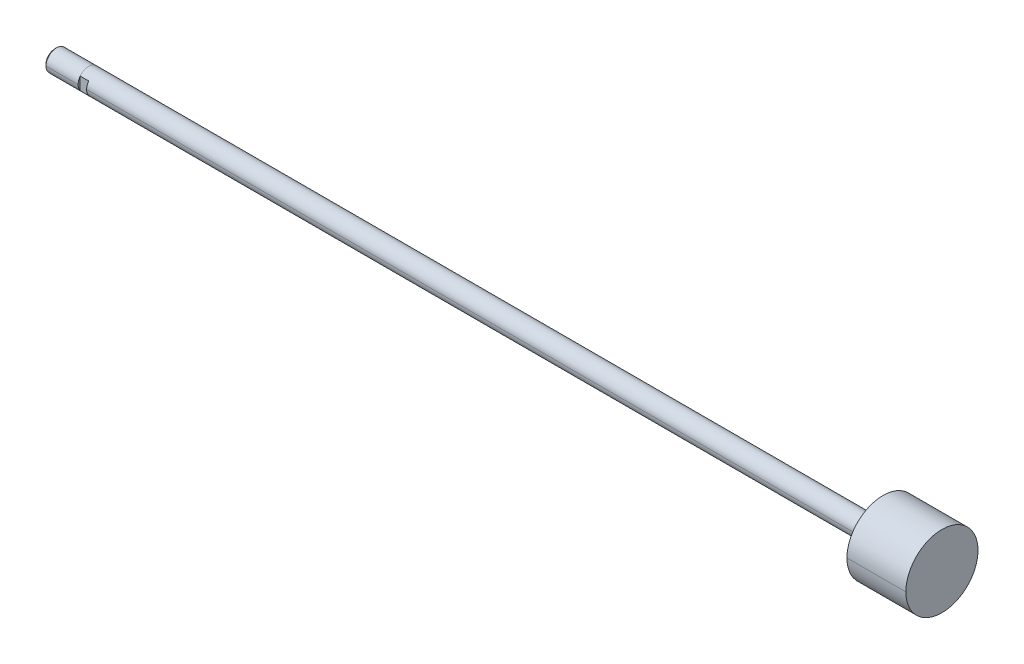
ISO-10303-21;
HEADER;
FILE_DESCRIPTION(('STEP AP214'),'2;1');
FILE_NAME('part.step','',(''),(''),'','','');
FILE_SCHEMA(('AUTOMOTIVE_DESIGN { 1 0 10303 214 1 1 1 1 }'));
ENDSEC;
DATA;
#1=APPLICATION_CONTEXT('core data for automotive mechanical design processes');
#2=APPLICATION_PROTOCOL_DEFINITION('international standard','automotive_design',2000,#1);
#3=PRODUCT_CONTEXT('',#1,'mechanical');
#4=PRODUCT('Part','Part','',(#3));
#5=PRODUCT_RELATED_PRODUCT_CATEGORY('part','',(#4));
#6=PRODUCT_DEFINITION_FORMATION('','',#4);
#7=PRODUCT_DEFINITION_CONTEXT('part definition',#1,'design');
#8=PRODUCT_DEFINITION('design','',#6,#7);
#9=PRODUCT_DEFINITION_SHAPE('','',#8);
#10=(LENGTH_UNIT() NAMED_UNIT(*) SI_UNIT(.MILLI.,.METRE.));
#11=(NAMED_UNIT(*) PLANE_ANGLE_UNIT() SI_UNIT($,.RADIAN.));
#12=(NAMED_UNIT(*) SI_UNIT($,.STERADIAN.) SOLID_ANGLE_UNIT());
#13=UNCERTAINTY_MEASURE_WITH_UNIT(LENGTH_MEASURE(1.E-05),#10,'distance_accuracy_value','');
#14=(GEOMETRIC_REPRESENTATION_CONTEXT(3) GLOBAL_UNCERTAINTY_ASSIGNED_CONTEXT((#13)) GLOBAL_UNIT_ASSIGNED_CONTEXT((#10,
#11,#12)) REPRESENTATION_CONTEXT('',''));
#15=CARTESIAN_POINT('',(0.,0.,0.));
#16=DIRECTION('',(0.,0.,1.));
#17=DIRECTION('',(1.,0.,0.));
#18=AXIS2_PLACEMENT_3D('',#15,#16,#17);
#19=CARTESIAN_POINT('',(317.3984,0.,0.));
#20=DIRECTION('',(-1.,0.,0.));
#21=DIRECTION('',(0.,-1.,0.));
#22=AXIS2_PLACEMENT_3D('',#19,#20,#21);
#23=CYLINDRICAL_SURFACE('',#22,3.9624);
#24=CARTESIAN_POINT('',(295.275,0.,0.));
#25=DIRECTION('',(1.,0.,0.));
#26=DIRECTION('',(0.,0.,-1.));
#27=AXIS2_PLACEMENT_3D('',#24,#25,#26);
#28=CIRCLE('',#27,3.9624);
#29=CARTESIAN_POINT('',(295.275,0.,-3.9624));
#30=VERTEX_POINT('',#29);
#31=CARTESIAN_POINT('',(295.275,0.,3.9624));
#32=VERTEX_POINT('',#31);
#33=EDGE_CURVE('E10',#30,#32,#28,.T.);
#34=ORIENTED_EDGE('',*,*,#33,.F.);
#35=DIRECTION('',(-1.,0.,0.));
#36=VECTOR('',#35,1.);
#37=CARTESIAN_POINT('',(295.275,0.,-3.9624));
#38=LINE('',#37,#36);
#39=CARTESIAN_POINT('',(0.,0.,-3.9624));
#40=VERTEX_POINT('',#39);
#41=EDGE_CURVE('E24',#30,#40,#38,.T.);
#42=ORIENTED_EDGE('',*,*,#41,.T.);
#43=CARTESIAN_POINT('',(0.,0.,0.));
#44=DIRECTION('',(1.,0.,0.));
#45=DIRECTION('',(0.,0.,-1.));
#46=AXIS2_PLACEMENT_3D('',#43,#44,#45);
#47=CIRCLE('',#46,3.9624);
#48=CARTESIAN_POINT('',(0.,2.37065154757084,-3.175));
#49=VERTEX_POINT('',#48);
#50=EDGE_CURVE('E244',#40,#49,#47,.T.);
#51=ORIENTED_EDGE('',*,*,#50,.T.);
#52=DIRECTION('',(1.,0.,0.));
#53=VECTOR('',#52,1.);
#54=CARTESIAN_POINT('',(317.3984,2.37065154757084,-3.175));
#55=LINE('',#54,#53);
#56=CARTESIAN_POINT('',(-3.175,2.37065154757084,-3.175));
#57=VERTEX_POINT('',#56);
#58=EDGE_CURVE('E239',#57,#49,#55,.T.);
#59=ORIENTED_EDGE('',*,*,#58,.F.);
#60=CARTESIAN_POINT('',(-3.17499999999997,0.,0.));
#61=DIRECTION('',(1.,0.,0.));
#62=DIRECTION('',(0.,0.,-1.));
#63=AXIS2_PLACEMENT_3D('',#60,#61,#62);
#64=CIRCLE('',#63,3.9624);
#65=CARTESIAN_POINT('',(-3.17499999999997,2.37065154757084,3.175));
#66=VERTEX_POINT('',#65);
#67=EDGE_CURVE('E235',#57,#66,#64,.T.);
#68=ORIENTED_EDGE('',*,*,#67,.T.);
#69=DIRECTION('',(1.,0.,0.));
#70=VECTOR('',#69,1.);
#71=CARTESIAN_POINT('',(317.3984,2.37065154757084,3.175));
#72=LINE('',#71,#70);
#73=CARTESIAN_POINT('',(0.,2.37065154757084,3.175));
#74=VERTEX_POINT('',#73);
#75=EDGE_CURVE('E231',#66,#74,#72,.T.);
#76=ORIENTED_EDGE('',*,*,#75,.T.);
#77=CARTESIAN_POINT('',(0.,0.,0.));
#78=DIRECTION('',(1.,0.,0.));
#79=DIRECTION('',(0.,0.,-1.));
#80=AXIS2_PLACEMENT_3D('',#77,#78,#79);
#81=CIRCLE('',#80,3.9624);
#82=CARTESIAN_POINT('',(0.,0.,3.9624));
#83=VERTEX_POINT('',#82);
#84=EDGE_CURVE('E227',#74,#83,#81,.T.);
#85=ORIENTED_EDGE('',*,*,#84,.T.);
#86=DIRECTION('',(-1.,0.,0.));
#87=VECTOR('',#86,1.);
#88=CARTESIAN_POINT('',(295.275,0.,3.9624));
#89=LINE('',#88,#87);
#90=EDGE_CURVE('E222',#32,#83,#89,.T.);
#91=ORIENTED_EDGE('',*,*,#90,.F.);
#92=EDGE_LOOP('',(#34,#42,#51,#59,#68,#76,#85,#91));
#93=FACE_BOUND('',#92,.T.);
#94=ADVANCED_FACE('F16',(#93),#23,.T.);
#95=CARTESIAN_POINT('',(317.3984,0.,0.));
#96=DIRECTION('',(-1.,0.,0.));
#97=DIRECTION('',(0.,1.,0.));
#98=AXIS2_PLACEMENT_3D('',#95,#96,#97);
#99=CYLINDRICAL_SURFACE('',#98,3.9624);
#100=CARTESIAN_POINT('',(0.,0.,0.));
#101=DIRECTION('',(1.,0.,0.));
#102=DIRECTION('',(0.,0.,-1.));
#103=AXIS2_PLACEMENT_3D('',#100,#101,#102);
#104=CIRCLE('',#103,3.9624);
#105=CARTESIAN_POINT('',(0.,-2.37065154757084,3.175));
#106=VERTEX_POINT('',#105);
#107=EDGE_CURVE('E218',#83,#106,#104,.T.);
#108=ORIENTED_EDGE('',*,*,#107,.T.);
#109=DIRECTION('',(1.,0.,0.));
#110=VECTOR('',#109,1.);
#111=CARTESIAN_POINT('',(317.3984,-2.37065154757084,3.175));
#112=LINE('',#111,#110);
#113=CARTESIAN_POINT('',(-3.175,-2.37065154757084,3.175));
#114=VERTEX_POINT('',#113);
#115=EDGE_CURVE('E213',#114,#106,#112,.T.);
#116=ORIENTED_EDGE('',*,*,#115,.F.);
#117=CARTESIAN_POINT('',(-3.17499999999997,0.,0.));
#118=DIRECTION('',(1.,0.,0.));
#119=DIRECTION('',(0.,0.,-1.));
#120=AXIS2_PLACEMENT_3D('',#117,#118,#119);
#121=CIRCLE('',#120,3.9624);
#122=CARTESIAN_POINT('',(-3.17499999999997,-2.37065154757084,-3.175));
#123=VERTEX_POINT('',#122);
#124=EDGE_CURVE('E209',#114,#123,#121,.T.);
#125=ORIENTED_EDGE('',*,*,#124,.T.);
#126=DIRECTION('',(1.,0.,0.));
#127=VECTOR('',#126,1.);
#128=CARTESIAN_POINT('',(317.3984,-2.37065154757084,-3.175));
#129=LINE('',#128,#127);
#130=CARTESIAN_POINT('',(0.,-2.37065154757084,-3.175));
#131=VERTEX_POINT('',#130);
#132=EDGE_CURVE('E205',#123,#131,#129,.T.);
#133=ORIENTED_EDGE('',*,*,#132,.T.);
#134=CARTESIAN_POINT('',(0.,0.,0.));
#135=DIRECTION('',(1.,0.,0.));
#136=DIRECTION('',(0.,0.,-1.));
#137=AXIS2_PLACEMENT_3D('',#134,#135,#136);
#138=CIRCLE('',#137,3.9624);
#139=EDGE_CURVE('E201',#131,#40,#138,.T.);
#140=ORIENTED_EDGE('',*,*,#139,.T.);
#141=ORIENTED_EDGE('',*,*,#41,.F.);
#142=CARTESIAN_POINT('',(295.275,0.,0.));
#143=DIRECTION('',(1.,0.,0.));
#144=DIRECTION('',(0.,0.,-1.));
#145=AXIS2_PLACEMENT_3D('',#142,#143,#144);
#146=CIRCLE('',#145,3.9624);
#147=EDGE_CURVE('E196',#32,#30,#146,.T.);
#148=ORIENTED_EDGE('',*,*,#147,.F.);
#149=ORIENTED_EDGE('',*,*,#90,.T.);
#150=EDGE_LOOP('',(#108,#116,#125,#133,#140,#141,#148,#149));
#151=FACE_BOUND('',#150,.T.);
#152=ADVANCED_FACE('F276',(#151),#99,.T.);
#153=CARTESIAN_POINT('',(295.275,3.9624,0.));
#154=DIRECTION('',(1.,0.,0.));
#155=DIRECTION('',(0.,0.,-1.));
#156=AXIS2_PLACEMENT_3D('',#153,#154,#155);
#157=PLANE('',#156);
#158=CARTESIAN_POINT('',(295.275,0.,0.));
#159=DIRECTION('',(1.,0.,0.));
#160=DIRECTION('',(0.,0.,-1.));
#161=AXIS2_PLACEMENT_3D('',#158,#159,#160);
#162=CIRCLE('',#161,13.55725);
#163=CARTESIAN_POINT('',(295.275,0.,-13.55725));
#164=VERTEX_POINT('',#163);
#165=CARTESIAN_POINT('',(295.275,0.,13.55725));
#166=VERTEX_POINT('',#165);
#167=EDGE_CURVE('E191',#164,#166,#162,.T.);
#168=ORIENTED_EDGE('',*,*,#167,.F.);
#169=CARTESIAN_POINT('',(295.275,0.,0.));
#170=DIRECTION('',(1.,0.,0.));
#171=DIRECTION('',(0.,0.,-1.));
#172=AXIS2_PLACEMENT_3D('',#169,#170,#171);
#173=CIRCLE('',#172,13.55725);
#174=EDGE_CURVE('E186',#166,#164,#173,.T.);
#175=ORIENTED_EDGE('',*,*,#174,.F.);
#176=EDGE_LOOP('',(#168,#175));
#177=FACE_BOUND('',#176,.T.);
#178=ORIENTED_EDGE('',*,*,#33,.T.);
#179=ORIENTED_EDGE('',*,*,#147,.T.);
#180=EDGE_LOOP('',(#178,#179));
#181=FACE_BOUND('',#180,.T.);
#182=ADVANCED_FACE('F279',(#177,#181),#157,.F.);
#183=CARTESIAN_POINT('',(317.3984,0.,0.));
#184=DIRECTION('',(-1.,0.,0.));
#185=DIRECTION('',(0.,1.,0.));
#186=AXIS2_PLACEMENT_3D('',#183,#184,#185);
#187=CYLINDRICAL_SURFACE('',#186,13.55725);
#188=ORIENTED_EDGE('',*,*,#174,.T.);
#189=DIRECTION('',(-1.,0.,0.));
#190=VECTOR('',#189,1.);
#191=CARTESIAN_POINT('',(317.3984,0.,-13.55725));
#192=LINE('',#191,#190);
#193=CARTESIAN_POINT('',(317.3984,0.,-13.55725));
#194=VERTEX_POINT('',#193);
#195=EDGE_CURVE('E181',#194,#164,#192,.T.);
#196=ORIENTED_EDGE('',*,*,#195,.F.);
#197=CARTESIAN_POINT('',(317.3984,0.,0.));
#198=DIRECTION('',(1.,0.,0.));
#199=DIRECTION('',(0.,0.,-1.));
#200=AXIS2_PLACEMENT_3D('',#197,#198,#199);
#201=CIRCLE('',#200,13.55725);
#202=CARTESIAN_POINT('',(317.3984,0.,13.55725));
#203=VERTEX_POINT('',#202);
#204=EDGE_CURVE('E176',#203,#194,#201,.T.);
#205=ORIENTED_EDGE('',*,*,#204,.F.);
#206=DIRECTION('',(-1.,0.,0.));
#207=VECTOR('',#206,1.);
#208=CARTESIAN_POINT('',(317.3984,0.,13.55725));
#209=LINE('',#208,#207);
#210=EDGE_CURVE('E171',#203,#166,#209,.T.);
#211=ORIENTED_EDGE('',*,*,#210,.T.);
#212=EDGE_LOOP('',(#188,#196,#205,#211));
#213=FACE_BOUND('',#212,.T.);
#214=ADVANCED_FACE('F281',(#213),#187,.T.);
#215=CARTESIAN_POINT('',(317.3984,0.,0.));
#216=DIRECTION('',(-1.,0.,0.));
#217=DIRECTION('',(0.,-1.,0.));
#218=AXIS2_PLACEMENT_3D('',#215,#216,#217);
#219=CYLINDRICAL_SURFACE('',#218,13.55725);
#220=CARTESIAN_POINT('',(317.3984,0.,0.));
#221=DIRECTION('',(1.,0.,0.));
#222=DIRECTION('',(0.,0.,-1.));
#223=AXIS2_PLACEMENT_3D('',#220,#221,#222);
#224=CIRCLE('',#223,13.55725);
#225=EDGE_CURVE('E166',#194,#203,#224,.T.);
#226=ORIENTED_EDGE('',*,*,#225,.F.);
#227=ORIENTED_EDGE('',*,*,#195,.T.);
#228=ORIENTED_EDGE('',*,*,#167,.T.);
#229=ORIENTED_EDGE('',*,*,#210,.F.);
#230=EDGE_LOOP('',(#226,#227,#228,#229));
#231=FACE_BOUND('',#230,.T.);
#232=ADVANCED_FACE('F289',(#231),#219,.T.);
#233=CARTESIAN_POINT('',(317.3984,13.55725,0.));
#234=DIRECTION('',(-1.,0.,0.));
#235=DIRECTION('',(0.,0.,1.));
#236=AXIS2_PLACEMENT_3D('',#233,#234,#235);
#237=PLANE('',#236);
#238=ORIENTED_EDGE('',*,*,#225,.T.);
#239=ORIENTED_EDGE('',*,*,#204,.T.);
#240=EDGE_LOOP('',(#238,#239));
#241=FACE_BOUND('',#240,.T.);
#242=ADVANCED_FACE('F322',(#241),#237,.F.);
#243=CARTESIAN_POINT('',(0.,0.,0.));
#244=DIRECTION('',(1.,0.,0.));
#245=DIRECTION('',(0.,0.,-1.));
#246=AXIS2_PLACEMENT_3D('',#243,#244,#245);
#247=PLANE('',#246);
#248=DIRECTION('',(0.,1.,0.));
#249=VECTOR('',#248,1.);
#250=CARTESIAN_POINT('',(0.,-3.9624,-3.175));
#251=LINE('',#250,#249);
#252=EDGE_CURVE('E161',#131,#49,#251,.T.);
#253=ORIENTED_EDGE('',*,*,#252,.T.);
#254=ORIENTED_EDGE('',*,*,#50,.F.);
#255=ORIENTED_EDGE('',*,*,#139,.F.);
#256=EDGE_LOOP('',(#253,#254,#255));
#257=FACE_BOUND('',#256,.T.);
#258=ADVANCED_FACE('F256',(#257),#247,.F.);
#259=CARTESIAN_POINT('',(0.,-3.9624,-3.175));
#260=DIRECTION('',(0.,0.,1.));
#261=DIRECTION('',(1.,0.,0.));
#262=AXIS2_PLACEMENT_3D('',#259,#260,#261);
#263=PLANE('',#262);
#264=DIRECTION('',(0.,1.,0.));
#265=VECTOR('',#264,1.);
#266=CARTESIAN_POINT('',(-3.175,-3.9624,-3.175));
#267=LINE('',#266,#265);
#268=EDGE_CURVE('E156',#123,#57,#267,.T.);
#269=ORIENTED_EDGE('',*,*,#268,.T.);
#270=ORIENTED_EDGE('',*,*,#58,.T.);
#271=ORIENTED_EDGE('',*,*,#252,.F.);
#272=ORIENTED_EDGE('',*,*,#132,.F.);
#273=EDGE_LOOP('',(#269,#270,#271,#272));
#274=FACE_BOUND('',#273,.T.);
#275=ADVANCED_FACE('F259',(#274),#263,.F.);
#276=CARTESIAN_POINT('',(-3.175,3.96875,0.));
#277=DIRECTION('',(-1.,0.,0.));
#278=DIRECTION('',(0.,0.,1.));
#279=AXIS2_PLACEMENT_3D('',#276,#277,#278);
#280=PLANE('',#279);
#281=ORIENTED_EDGE('',*,*,#67,.F.);
#282=ORIENTED_EDGE('',*,*,#268,.F.);
#283=ORIENTED_EDGE('',*,*,#124,.F.);
#284=DIRECTION('',(0.,-1.,0.));
#285=VECTOR('',#284,1.);
#286=CARTESIAN_POINT('',(-3.175,3.9624,3.175));
#287=LINE('',#286,#285);
#288=EDGE_CURVE('E151',#66,#114,#287,.T.);
#289=ORIENTED_EDGE('',*,*,#288,.F.);
#290=EDGE_LOOP('',(#281,#282,#283,#289));
#291=FACE_BOUND('',#290,.T.);
#292=CARTESIAN_POINT('',(-3.175,0.,0.));
#293=DIRECTION('',(1.,0.,0.));
#294=DIRECTION('',(0.,0.,-1.));
#295=AXIS2_PLACEMENT_3D('',#292,#293,#294);
#296=CIRCLE('',#295,3.96875);
#297=CARTESIAN_POINT('',(-3.175,0.,-3.96875));
#298=VERTEX_POINT('',#297);
#299=CARTESIAN_POINT('',(-3.175,0.,3.96875));
#300=VERTEX_POINT('',#299);
#301=EDGE_CURVE('E147',#298,#300,#296,.T.);
#302=ORIENTED_EDGE('',*,*,#301,.T.);
#303=CARTESIAN_POINT('',(-3.175,0.,0.));
#304=DIRECTION('',(1.,0.,0.));
#305=DIRECTION('',(0.,0.,-1.));
#306=AXIS2_PLACEMENT_3D('',#303,#304,#305);
#307=CIRCLE('',#306,3.96875);
#308=EDGE_CURVE('E143',#300,#298,#307,.T.);
#309=ORIENTED_EDGE('',*,*,#308,.T.);
#310=EDGE_LOOP('',(#302,#309));
#311=FACE_BOUND('',#310,.T.);
#312=ADVANCED_FACE('F265',(#291,#311),#280,.F.);
#313=CARTESIAN_POINT('',(-3.175,0.,0.));
#314=DIRECTION('',(-1.,0.,0.));
#315=DIRECTION('',(0.,1.,0.));
#316=AXIS2_PLACEMENT_3D('',#313,#314,#315);
#317=CYLINDRICAL_SURFACE('',#316,3.96875);
#318=CARTESIAN_POINT('',(-15.24508,0.,0.));
#319=DIRECTION('',(1.,0.,0.));
#320=DIRECTION('',(0.,0.,-1.));
#321=AXIS2_PLACEMENT_3D('',#318,#319,#320);
#322=CIRCLE('',#321,3.96875);
#323=CARTESIAN_POINT('',(-15.2450800000016,0.,3.96875000000161));
#324=VERTEX_POINT('',#323);
#325=CARTESIAN_POINT('',(-15.24508,0.,-3.96875));
#326=VERTEX_POINT('',#325);
#327=EDGE_CURVE('E109',#324,#326,#322,.T.);
#328=ORIENTED_EDGE('',*,*,#327,.T.);
#329=DIRECTION('',(-1.,0.,0.));
#330=VECTOR('',#329,1.);
#331=CARTESIAN_POINT('',(-3.175,0.,-3.96875));
#332=LINE('',#331,#330);
#333=EDGE_CURVE('E135',#298,#326,#332,.T.);
#334=ORIENTED_EDGE('',*,*,#333,.F.);
#335=ORIENTED_EDGE('',*,*,#308,.F.);
#336=DIRECTION('',(-1.,0.,0.));
#337=VECTOR('',#336,1.);
#338=CARTESIAN_POINT('',(-3.175,0.,3.96875));
#339=LINE('',#338,#337);
#340=EDGE_CURVE('E131',#300,#324,#339,.T.);
#341=ORIENTED_EDGE('',*,*,#340,.T.);
#342=EDGE_LOOP('',(#328,#334,#335,#341));
#343=FACE_BOUND('',#342,.T.);
#344=ADVANCED_FACE('F357',(#343),#317,.T.);
#345=CARTESIAN_POINT('',(-3.175,0.,0.));
#346=DIRECTION('',(-1.,0.,0.));
#347=DIRECTION('',(0.,-1.,0.));
#348=AXIS2_PLACEMENT_3D('',#345,#346,#347);
#349=CYLINDRICAL_SURFACE('',#348,3.96875);
#350=ORIENTED_EDGE('',*,*,#301,.F.);
#351=ORIENTED_EDGE('',*,*,#333,.T.);
#352=CARTESIAN_POINT('',(-15.24508,0.,0.));
#353=DIRECTION('',(1.,0.,0.));
#354=DIRECTION('',(0.,0.,-1.));
#355=AXIS2_PLACEMENT_3D('',#352,#353,#354);
#356=CIRCLE('',#355,3.96875);
#357=EDGE_CURVE('E126',#326,#324,#356,.T.);
#358=ORIENTED_EDGE('',*,*,#357,.T.);
#359=ORIENTED_EDGE('',*,*,#340,.F.);
#360=EDGE_LOOP('',(#350,#351,#358,#359));
#361=FACE_BOUND('',#360,.T.);
#362=ADVANCED_FACE('F366',(#361),#349,.T.);
#363=CARTESIAN_POINT('',(-15.875,0.,0.));
#364=DIRECTION('',(1.,0.,0.));
#365=DIRECTION('',(0.,-1.,0.));
#366=AXIS2_PLACEMENT_3D('',#363,#364,#365);
#367=CONICAL_SURFACE('',#366,3.33883,0.7853981634);
#368=ORIENTED_EDGE('',*,*,#357,.F.);
#369=DIRECTION('',(0.707106781184745,0.,-0.70710678118835));
#370=VECTOR('',#369,1.);
#371=CARTESIAN_POINT('',(-15.875,0.,-3.33883));
#372=LINE('',#371,#370);
#373=CARTESIAN_POINT('',(-15.875,0.,-3.33883));
#374=VERTEX_POINT('',#373);
#375=EDGE_CURVE('E101',#374,#326,#372,.T.);
#376=ORIENTED_EDGE('',*,*,#375,.F.);
#377=CARTESIAN_POINT('',(-15.875,0.,0.));
#378=DIRECTION('',(1.,0.,0.));
#379=DIRECTION('',(0.,0.,-1.));
#380=AXIS2_PLACEMENT_3D('',#377,#378,#379);
#381=CIRCLE('',#380,3.33883);
#382=CARTESIAN_POINT('',(-15.875,0.,3.33883));
#383=VERTEX_POINT('',#382);
#384=EDGE_CURVE('E94',#374,#383,#381,.T.);
#385=ORIENTED_EDGE('',*,*,#384,.T.);
#386=DIRECTION('',(0.707106781184743,0.,0.707106781188352));
#387=VECTOR('',#386,1.);
#388=CARTESIAN_POINT('',(-15.875,0.,3.33883));
#389=LINE('',#388,#387);
#390=EDGE_CURVE('E98',#383,#324,#389,.T.);
#391=ORIENTED_EDGE('',*,*,#390,.T.);
#392=EDGE_LOOP('',(#368,#376,#385,#391));
#393=FACE_BOUND('',#392,.T.);
#394=ADVANCED_FACE('F97',(#393),#367,.T.);
#395=CARTESIAN_POINT('',(-15.875,0.,0.));
#396=DIRECTION('',(1.,0.,0.));
#397=DIRECTION('',(0.,1.,0.));
#398=AXIS2_PLACEMENT_3D('',#395,#396,#397);
#399=CONICAL_SURFACE('',#398,3.33883,0.7853981634);
#400=CARTESIAN_POINT('',(-15.875,0.,0.));
#401=DIRECTION('',(1.,0.,0.));
#402=DIRECTION('',(0.,0.,-1.));
#403=AXIS2_PLACEMENT_3D('',#400,#401,#402);
#404=CIRCLE('',#403,3.33883);
#405=EDGE_CURVE('E108',#383,#374,#404,.T.);
#406=ORIENTED_EDGE('',*,*,#405,.T.);
#407=ORIENTED_EDGE('',*,*,#375,.T.);
#408=ORIENTED_EDGE('',*,*,#327,.F.);
#409=ORIENTED_EDGE('',*,*,#390,.F.);
#410=EDGE_LOOP('',(#406,#407,#408,#409));
#411=FACE_BOUND('',#410,.T.);
#412=ADVANCED_FACE('F107',(#411),#399,.T.);
#413=CARTESIAN_POINT('',(-15.875,0.,0.));
#414=DIRECTION('',(1.,0.,0.));
#415=DIRECTION('',(0.,0.,-1.));
#416=AXIS2_PLACEMENT_3D('',#413,#414,#415);
#417=PLANE('',#416);
#418=ORIENTED_EDGE('',*,*,#384,.F.);
#419=ORIENTED_EDGE('',*,*,#405,.F.);
#420=EDGE_LOOP('',(#418,#419));
#421=FACE_BOUND('',#420,.T.);
#422=ADVANCED_FACE('F111',(#421),#417,.F.);
#423=CARTESIAN_POINT('',(0.,3.9624,3.175));
#424=DIRECTION('',(0.,0.,-1.));
#425=DIRECTION('',(-1.,0.,0.));
#426=AXIS2_PLACEMENT_3D('',#423,#424,#425);
#427=PLANE('',#426);
#428=ORIENTED_EDGE('',*,*,#288,.T.);
#429=ORIENTED_EDGE('',*,*,#115,.T.);
#430=DIRECTION('',(0.,-1.,0.));
#431=VECTOR('',#430,1.);
#432=CARTESIAN_POINT('',(0.,3.9624,3.175));
#433=LINE('',#432,#431);
#434=EDGE_CURVE('E112',#74,#106,#433,.T.);
#435=ORIENTED_EDGE('',*,*,#434,.F.);
#436=ORIENTED_EDGE('',*,*,#75,.F.);
#437=EDGE_LOOP('',(#428,#429,#435,#436));
#438=FACE_BOUND('',#437,.T.);
#439=ADVANCED_FACE('F271',(#438),#427,.F.);
#440=CARTESIAN_POINT('',(0.,0.,0.));
#441=DIRECTION('',(1.,0.,0.));
#442=DIRECTION('',(0.,0.,-1.));
#443=AXIS2_PLACEMENT_3D('',#440,#441,#442);
#444=PLANE('',#443);
#445=ORIENTED_EDGE('',*,*,#434,.T.);
#446=ORIENTED_EDGE('',*,*,#107,.F.);
#447=ORIENTED_EDGE('',*,*,#84,.F.);
#448=EDGE_LOOP('',(#445,#446,#447));
#449=FACE_BOUND('',#448,.T.);
#450=ADVANCED_FACE('F274',(#449),#444,.F.);
#451=CLOSED_SHELL('',(#94,#152,#182,#214,#232,#242,#258,#275,#312,#344,#362,#394,#412,#422,#439,#450));
#452=MANIFOLD_SOLID_BREP('B1',#451);
#453=ADVANCED_BREP_SHAPE_REPRESENTATION('',(#18,#452),#14);
#454=SHAPE_DEFINITION_REPRESENTATION(#9,#453);
ENDSEC;
END-ISO-10303-21;
